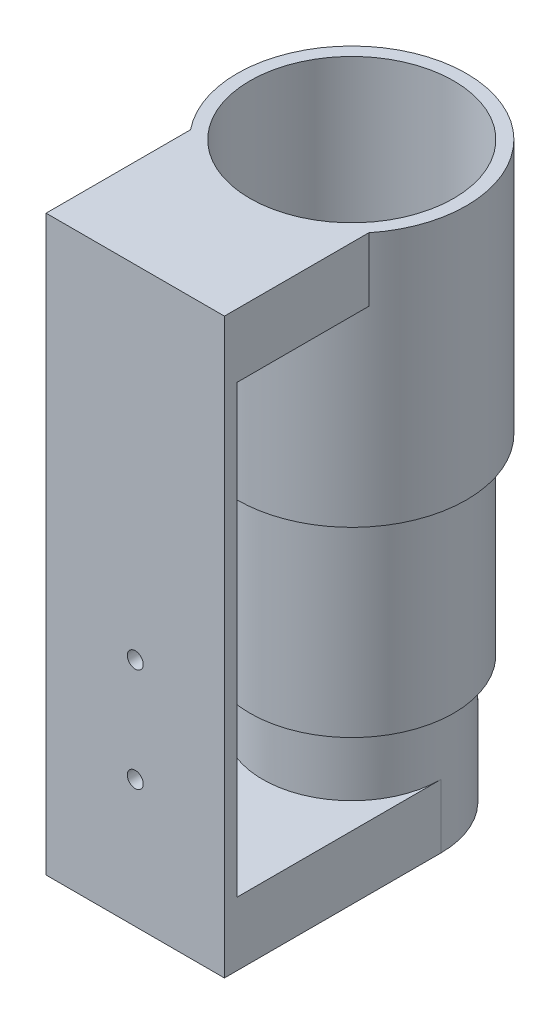
ISO-10303-21;
HEADER;
FILE_DESCRIPTION(('STEP AP214'),'2;1');
FILE_NAME('part.step','',(''),(''),'','','');
FILE_SCHEMA(('AUTOMOTIVE_DESIGN { 1 0 10303 214 1 1 1 1 }'));
ENDSEC;
DATA;
#1=APPLICATION_CONTEXT('core data for automotive mechanical design processes');
#2=APPLICATION_PROTOCOL_DEFINITION('international standard','automotive_design',2000,#1);
#3=PRODUCT_CONTEXT('',#1,'mechanical');
#4=PRODUCT('Part','Part','',(#3));
#5=PRODUCT_RELATED_PRODUCT_CATEGORY('part','',(#4));
#6=PRODUCT_DEFINITION_FORMATION('','',#4);
#7=PRODUCT_DEFINITION_CONTEXT('part definition',#1,'design');
#8=PRODUCT_DEFINITION('design','',#6,#7);
#9=PRODUCT_DEFINITION_SHAPE('','',#8);
#10=(LENGTH_UNIT() NAMED_UNIT(*) SI_UNIT(.MILLI.,.METRE.));
#11=(NAMED_UNIT(*) PLANE_ANGLE_UNIT() SI_UNIT($,.RADIAN.));
#12=(NAMED_UNIT(*) SI_UNIT($,.STERADIAN.) SOLID_ANGLE_UNIT());
#13=UNCERTAINTY_MEASURE_WITH_UNIT(LENGTH_MEASURE(1.E-05),#10,'distance_accuracy_value','');
#14=(GEOMETRIC_REPRESENTATION_CONTEXT(3) GLOBAL_UNCERTAINTY_ASSIGNED_CONTEXT((#13)) GLOBAL_UNIT_ASSIGNED_CONTEXT((#10,
#11,#12)) REPRESENTATION_CONTEXT('',''));
#15=CARTESIAN_POINT('',(0.,0.,0.));
#16=DIRECTION('',(0.,0.,1.));
#17=DIRECTION('',(1.,0.,0.));
#18=AXIS2_PLACEMENT_3D('',#15,#16,#17);
#19=CARTESIAN_POINT('',(0.,114.3,0.));
#20=DIRECTION('',(0.,1.,0.));
#21=DIRECTION('',(0.,0.,1.));
#22=AXIS2_PLACEMENT_3D('',#19,#20,#21);
#23=PLANE('',#22);
#24=CARTESIAN_POINT('',(0.,114.3,0.));
#25=DIRECTION('',(0.,1.,0.));
#26=DIRECTION('',(0.,0.,1.));
#27=AXIS2_PLACEMENT_3D('',#24,#25,#26);
#28=CIRCLE('',#27,22.86);
#29=CARTESIAN_POINT('',(17.78,114.3,14.3684097937106));
#30=VERTEX_POINT('',#29);
#31=CARTESIAN_POINT('',(-17.78,114.3,14.3684097937107));
#32=VERTEX_POINT('',#31);
#33=EDGE_CURVE('E12',#30,#32,#28,.T.);
#34=ORIENTED_EDGE('',*,*,#33,.T.);
#35=DIRECTION('',(0.,0.,1.));
#36=VECTOR('',#35,1.);
#37=CARTESIAN_POINT('',(-17.78,114.3,40.6405249409841));
#38=LINE('',#37,#36);
#39=CARTESIAN_POINT('',(-17.78,114.3,43.1805249409841));
#40=VERTEX_POINT('',#39);
#41=EDGE_CURVE('E78',#32,#40,#38,.T.);
#42=ORIENTED_EDGE('',*,*,#41,.T.);
#43=DIRECTION('',(-1.,0.,0.));
#44=VECTOR('',#43,1.);
#45=CARTESIAN_POINT('',(17.78,114.3,43.1805249409841));
#46=LINE('',#45,#44);
#47=CARTESIAN_POINT('',(17.78,114.3,43.1805249409841));
#48=VERTEX_POINT('',#47);
#49=EDGE_CURVE('E151',#48,#40,#46,.T.);
#50=ORIENTED_EDGE('',*,*,#49,.F.);
#51=DIRECTION('',(0.,0.,-1.));
#52=VECTOR('',#51,1.);
#53=CARTESIAN_POINT('',(17.78,114.3,40.6405249409841));
#54=LINE('',#53,#52);
#55=EDGE_CURVE('E57',#48,#30,#54,.T.);
#56=ORIENTED_EDGE('',*,*,#55,.T.);
#57=EDGE_LOOP('',(#34,#42,#50,#56));
#58=FACE_BOUND('',#57,.T.);
#59=CARTESIAN_POINT('',(0.,114.3,0.));
#60=DIRECTION('',(0.,1.,0.));
#61=DIRECTION('',(0.,0.,1.));
#62=AXIS2_PLACEMENT_3D('',#59,#60,#61);
#63=CIRCLE('',#62,20.32);
#64=CARTESIAN_POINT('',(0.,114.3,20.32));
#65=VERTEX_POINT('',#64);
#66=EDGE_CURVE('E241',#65,#65,#63,.T.);
#67=ORIENTED_EDGE('',*,*,#66,.F.);
#68=EDGE_LOOP('',(#67));
#69=FACE_BOUND('',#68,.T.);
#70=ADVANCED_FACE('F41',(#58,#69),#23,.T.);
#71=CARTESIAN_POINT('',(0.,63.5,0.));
#72=DIRECTION('',(0.,1.,0.));
#73=DIRECTION('',(0.,0.,1.));
#74=AXIS2_PLACEMENT_3D('',#71,#72,#73);
#75=PLANE('',#74);
#76=CARTESIAN_POINT('',(0.,63.5,0.));
#77=DIRECTION('',(0.,1.,0.));
#78=DIRECTION('',(0.,0.,1.));
#79=AXIS2_PLACEMENT_3D('',#76,#77,#78);
#80=CIRCLE('',#79,22.86);
#81=CARTESIAN_POINT('',(0.,63.5,22.86));
#82=VERTEX_POINT('',#81);
#83=EDGE_CURVE('E50',#82,#82,#80,.T.);
#84=ORIENTED_EDGE('',*,*,#83,.F.);
#85=EDGE_LOOP('',(#84));
#86=FACE_BOUND('',#85,.T.);
#87=CARTESIAN_POINT('',(0.,63.5,0.));
#88=DIRECTION('',(0.,1.,0.));
#89=DIRECTION('',(0.,0.,1.));
#90=AXIS2_PLACEMENT_3D('',#87,#88,#89);
#91=CIRCLE('',#90,20.32);
#92=CARTESIAN_POINT('',(0.,63.5,20.32));
#93=VERTEX_POINT('',#92);
#94=EDGE_CURVE('E239',#93,#93,#91,.T.);
#95=ORIENTED_EDGE('',*,*,#94,.T.);
#96=EDGE_LOOP('',(#95));
#97=FACE_BOUND('',#96,.T.);
#98=ADVANCED_FACE('F279',(#86,#97),#75,.F.);
#99=CARTESIAN_POINT('',(0.,114.3,0.));
#100=DIRECTION('',(0.,-1.,0.));
#101=DIRECTION('',(0.,0.,-1.));
#102=AXIS2_PLACEMENT_3D('',#99,#100,#101);
#103=CYLINDRICAL_SURFACE('',#102,22.86);
#104=CARTESIAN_POINT('',(0.,101.6,0.));
#105=DIRECTION('',(0.,-1.,0.));
#106=DIRECTION('',(0.,0.,-1.));
#107=AXIS2_PLACEMENT_3D('',#104,#105,#106);
#108=CIRCLE('',#107,22.86);
#109=CARTESIAN_POINT('',(17.78,101.6,14.3684097937106));
#110=VERTEX_POINT('',#109);
#111=CARTESIAN_POINT('',(-17.78,101.6,14.3684097937107));
#112=VERTEX_POINT('',#111);
#113=EDGE_CURVE('E231',#110,#112,#108,.T.);
#114=ORIENTED_EDGE('',*,*,#113,.T.);
#115=DIRECTION('',(0.,1.,0.));
#116=VECTOR('',#115,1.);
#117=CARTESIAN_POINT('',(-17.78,101.6,14.3684097937107));
#118=LINE('',#117,#116);
#119=EDGE_CURVE('E237',#112,#32,#118,.T.);
#120=ORIENTED_EDGE('',*,*,#119,.T.);
#121=ORIENTED_EDGE('',*,*,#33,.F.);
#122=DIRECTION('',(0.,1.,0.));
#123=VECTOR('',#122,1.);
#124=CARTESIAN_POINT('',(17.78,101.6,14.3684097937106));
#125=LINE('',#124,#123);
#126=EDGE_CURVE('E143',#110,#30,#125,.T.);
#127=ORIENTED_EDGE('',*,*,#126,.F.);
#128=EDGE_LOOP('',(#114,#120,#121,#127));
#129=FACE_BOUND('',#128,.T.);
#130=ORIENTED_EDGE('',*,*,#83,.T.);
#131=EDGE_LOOP('',(#130));
#132=FACE_BOUND('',#131,.T.);
#133=ADVANCED_FACE('F43',(#129,#132),#103,.T.);
#134=CARTESIAN_POINT('',(0.,114.3,0.));
#135=DIRECTION('',(0.,-1.,0.));
#136=DIRECTION('',(0.,0.,-1.));
#137=AXIS2_PLACEMENT_3D('',#134,#135,#136);
#138=CYLINDRICAL_SURFACE('',#137,20.32);
#139=ORIENTED_EDGE('',*,*,#66,.T.);
#140=EDGE_LOOP('',(#139));
#141=FACE_BOUND('',#140,.T.);
#142=ORIENTED_EDGE('',*,*,#94,.F.);
#143=EDGE_LOOP('',(#142));
#144=FACE_BOUND('',#143,.T.);
#145=ADVANCED_FACE('F286',(#141,#144),#138,.F.);
#146=CARTESIAN_POINT('',(-17.78,101.6,40.6405249409841));
#147=DIRECTION('',(-1.,0.,0.));
#148=DIRECTION('',(0.,0.,1.));
#149=AXIS2_PLACEMENT_3D('',#146,#147,#148);
#150=PLANE('',#149);
#151=ORIENTED_EDGE('',*,*,#41,.F.);
#152=ORIENTED_EDGE('',*,*,#119,.F.);
#153=DIRECTION('',(0.,0.,1.));
#154=VECTOR('',#153,1.);
#155=CARTESIAN_POINT('',(-17.78,101.6,40.6405249409841));
#156=LINE('',#155,#154);
#157=CARTESIAN_POINT('',(-17.78,101.6,40.6405249409841));
#158=VERTEX_POINT('',#157);
#159=EDGE_CURVE('E234',#112,#158,#156,.T.);
#160=ORIENTED_EDGE('',*,*,#159,.T.);
#161=DIRECTION('',(0.,1.,0.));
#162=VECTOR('',#161,1.);
#163=CARTESIAN_POINT('',(-17.78,12.7,40.6405249409841));
#164=LINE('',#163,#162);
#165=CARTESIAN_POINT('',(-17.78,12.7,40.6405249409841));
#166=VERTEX_POINT('',#165);
#167=EDGE_CURVE('E161',#166,#158,#164,.T.);
#168=ORIENTED_EDGE('',*,*,#167,.F.);
#169=DIRECTION('',(0.,0.,1.));
#170=VECTOR('',#169,1.);
#171=CARTESIAN_POINT('',(-17.78,12.7,0.));
#172=LINE('',#171,#170);
#173=CARTESIAN_POINT('',(-17.78,12.7,0.));
#174=VERTEX_POINT('',#173);
#175=EDGE_CURVE('E170',#174,#166,#172,.T.);
#176=ORIENTED_EDGE('',*,*,#175,.F.);
#177=DIRECTION('',(0.,-1.,0.));
#178=VECTOR('',#177,1.);
#179=CARTESIAN_POINT('',(-17.78,12.7,0.));
#180=LINE('',#179,#178);
#181=CARTESIAN_POINT('',(-17.78,0.,0.));
#182=VERTEX_POINT('',#181);
#183=EDGE_CURVE('E182',#174,#182,#180,.T.);
#184=ORIENTED_EDGE('',*,*,#183,.T.);
#185=DIRECTION('',(0.,0.,1.));
#186=VECTOR('',#185,1.);
#187=CARTESIAN_POINT('',(-17.78,0.,0.));
#188=LINE('',#187,#186);
#189=CARTESIAN_POINT('',(-17.78,0.,43.1805249409841));
#190=VERTEX_POINT('',#189);
#191=EDGE_CURVE('E175',#182,#190,#188,.T.);
#192=ORIENTED_EDGE('',*,*,#191,.T.);
#193=DIRECTION('',(0.,-1.,0.));
#194=VECTOR('',#193,1.);
#195=CARTESIAN_POINT('',(-17.78,12.7,43.1805249409841));
#196=LINE('',#195,#194);
#197=EDGE_CURVE('E154',#40,#190,#196,.T.);
#198=ORIENTED_EDGE('',*,*,#197,.F.);
#199=EDGE_LOOP('',(#151,#152,#160,#168,#176,#184,#192,#198));
#200=FACE_BOUND('',#199,.T.);
#201=ADVANCED_FACE('F289',(#200),#150,.T.);
#202=CARTESIAN_POINT('',(17.78,101.6,40.6405249409841));
#203=DIRECTION('',(1.,0.,0.));
#204=DIRECTION('',(0.,0.,-1.));
#205=AXIS2_PLACEMENT_3D('',#202,#203,#204);
#206=PLANE('',#205);
#207=ORIENTED_EDGE('',*,*,#55,.F.);
#208=DIRECTION('',(0.,-1.,0.));
#209=VECTOR('',#208,1.);
#210=CARTESIAN_POINT('',(17.78,12.7,43.1805249409841));
#211=LINE('',#210,#209);
#212=CARTESIAN_POINT('',(17.78,0.,43.1805249409841));
#213=VERTEX_POINT('',#212);
#214=EDGE_CURVE('E140',#48,#213,#211,.T.);
#215=ORIENTED_EDGE('',*,*,#214,.T.);
#216=DIRECTION('',(0.,0.,-1.));
#217=VECTOR('',#216,1.);
#218=CARTESIAN_POINT('',(17.78,0.,0.));
#219=LINE('',#218,#217);
#220=CARTESIAN_POINT('',(17.78,0.,0.));
#221=VERTEX_POINT('',#220);
#222=EDGE_CURVE('E171',#213,#221,#219,.T.);
#223=ORIENTED_EDGE('',*,*,#222,.T.);
#224=DIRECTION('',(0.,-1.,0.));
#225=VECTOR('',#224,1.);
#226=CARTESIAN_POINT('',(17.78,12.7,0.));
#227=LINE('',#226,#225);
#228=CARTESIAN_POINT('',(17.78,12.7,0.));
#229=VERTEX_POINT('',#228);
#230=EDGE_CURVE('E155',#229,#221,#227,.T.);
#231=ORIENTED_EDGE('',*,*,#230,.F.);
#232=DIRECTION('',(0.,0.,-1.));
#233=VECTOR('',#232,1.);
#234=CARTESIAN_POINT('',(17.78,12.7,0.));
#235=LINE('',#234,#233);
#236=CARTESIAN_POINT('',(17.78,12.7,40.6405249409841));
#237=VERTEX_POINT('',#236);
#238=EDGE_CURVE('E173',#237,#229,#235,.T.);
#239=ORIENTED_EDGE('',*,*,#238,.F.);
#240=DIRECTION('',(0.,1.,0.));
#241=VECTOR('',#240,1.);
#242=CARTESIAN_POINT('',(17.78,12.7,40.6405249409841));
#243=LINE('',#242,#241);
#244=CARTESIAN_POINT('',(17.78,101.6,40.6405249409841));
#245=VERTEX_POINT('',#244);
#246=EDGE_CURVE('E158',#237,#245,#243,.T.);
#247=ORIENTED_EDGE('',*,*,#246,.T.);
#248=DIRECTION('',(0.,0.,-1.));
#249=VECTOR('',#248,1.);
#250=CARTESIAN_POINT('',(17.78,101.6,40.6405249409841));
#251=LINE('',#250,#249);
#252=EDGE_CURVE('E84',#245,#110,#251,.T.);
#253=ORIENTED_EDGE('',*,*,#252,.T.);
#254=ORIENTED_EDGE('',*,*,#126,.T.);
#255=EDGE_LOOP('',(#207,#215,#223,#231,#239,#247,#253,#254));
#256=FACE_BOUND('',#255,.T.);
#257=ADVANCED_FACE('F139',(#256),#206,.T.);
#258=CARTESIAN_POINT('',(0.,101.6,0.));
#259=DIRECTION('',(0.,-1.,0.));
#260=DIRECTION('',(0.,0.,-1.));
#261=AXIS2_PLACEMENT_3D('',#258,#259,#260);
#262=PLANE('',#261);
#263=DIRECTION('',(1.,0.,0.));
#264=VECTOR('',#263,1.);
#265=CARTESIAN_POINT('',(17.78,101.6,40.6405249409841));
#266=LINE('',#265,#264);
#267=EDGE_CURVE('E66',#158,#245,#266,.T.);
#268=ORIENTED_EDGE('',*,*,#267,.F.);
#269=ORIENTED_EDGE('',*,*,#159,.F.);
#270=ORIENTED_EDGE('',*,*,#113,.F.);
#271=ORIENTED_EDGE('',*,*,#252,.F.);
#272=EDGE_LOOP('',(#268,#269,#270,#271));
#273=FACE_BOUND('',#272,.T.);
#274=ADVANCED_FACE('F293',(#273),#262,.T.);
#275=CARTESIAN_POINT('',(0.,12.7,0.));
#276=DIRECTION('',(0.,-1.,0.));
#277=DIRECTION('',(0.,0.,-1.));
#278=AXIS2_PLACEMENT_3D('',#275,#276,#277);
#279=PLANE('',#278);
#280=DIRECTION('',(-1.,0.,0.));
#281=VECTOR('',#280,1.);
#282=CARTESIAN_POINT('',(0.,12.7,40.6405249409841));
#283=LINE('',#282,#281);
#284=EDGE_CURVE('E145',#237,#166,#283,.T.);
#285=ORIENTED_EDGE('',*,*,#284,.F.);
#286=ORIENTED_EDGE('',*,*,#238,.T.);
#287=CARTESIAN_POINT('',(0.,12.7,0.));
#288=DIRECTION('',(0.,-1.,0.));
#289=DIRECTION('',(0.,0.,-1.));
#290=AXIS2_PLACEMENT_3D('',#287,#288,#289);
#291=CIRCLE('',#290,17.78);
#292=EDGE_CURVE('E167',#229,#174,#291,.T.);
#293=ORIENTED_EDGE('',*,*,#292,.T.);
#294=ORIENTED_EDGE('',*,*,#175,.T.);
#295=EDGE_LOOP('',(#285,#286,#293,#294));
#296=FACE_BOUND('',#295,.T.);
#297=ADVANCED_FACE('F298',(#296),#279,.F.);
#298=CARTESIAN_POINT('',(0.,25.4,0.));
#299=DIRECTION('',(0.,-1.,0.));
#300=DIRECTION('',(0.,0.,-1.));
#301=AXIS2_PLACEMENT_3D('',#298,#299,#300);
#302=CYLINDRICAL_SURFACE('',#301,17.78);
#303=CARTESIAN_POINT('',(0.,25.4,0.));
#304=DIRECTION('',(0.,1.,0.));
#305=DIRECTION('',(0.,0.,1.));
#306=AXIS2_PLACEMENT_3D('',#303,#304,#305);
#307=CIRCLE('',#306,17.78);
#308=CARTESIAN_POINT('',(0.,25.4,17.78));
#309=VERTEX_POINT('',#308);
#310=EDGE_CURVE('E189',#309,#309,#307,.T.);
#311=ORIENTED_EDGE('',*,*,#310,.F.);
#312=EDGE_LOOP('',(#311));
#313=FACE_BOUND('',#312,.T.);
#314=ORIENTED_EDGE('',*,*,#183,.F.);
#315=ORIENTED_EDGE('',*,*,#292,.F.);
#316=ORIENTED_EDGE('',*,*,#230,.T.);
#317=CARTESIAN_POINT('',(0.,0.,0.));
#318=DIRECTION('',(0.,1.,0.));
#319=DIRECTION('',(0.,0.,1.));
#320=AXIS2_PLACEMENT_3D('',#317,#318,#319);
#321=CIRCLE('',#320,17.78);
#322=EDGE_CURVE('E188',#221,#182,#321,.T.);
#323=ORIENTED_EDGE('',*,*,#322,.T.);
#324=EDGE_LOOP('',(#314,#315,#316,#323));
#325=FACE_BOUND('',#324,.T.);
#326=ADVANCED_FACE('F307',(#313,#325),#302,.T.);
#327=CARTESIAN_POINT('',(0.,6.35,0.));
#328=DIRECTION('',(0.,1.,0.));
#329=DIRECTION('',(0.,0.,1.));
#330=AXIS2_PLACEMENT_3D('',#327,#328,#329);
#331=PLANE('',#330);
#332=CARTESIAN_POINT('',(0.,6.35,0.));
#333=DIRECTION('',(0.,1.,0.));
#334=DIRECTION('',(0.,0.,1.));
#335=AXIS2_PLACEMENT_3D('',#332,#333,#334);
#336=CIRCLE('',#335,15.24);
#337=CARTESIAN_POINT('',(0.,6.35,15.24));
#338=VERTEX_POINT('',#337);
#339=EDGE_CURVE('E192',#338,#338,#336,.F.);
#340=ORIENTED_EDGE('',*,*,#339,.F.);
#341=EDGE_LOOP('',(#340));
#342=FACE_BOUND('',#341,.T.);
#343=DIRECTION('',(-1.,0.,0.));
#344=VECTOR('',#343,1.);
#345=CARTESIAN_POINT('',(-3.81,6.35,-3.81));
#346=LINE('',#345,#344);
#347=CARTESIAN_POINT('',(3.81,6.35,-3.81));
#348=VERTEX_POINT('',#347);
#349=CARTESIAN_POINT('',(-3.81,6.35,-3.81));
#350=VERTEX_POINT('',#349);
#351=EDGE_CURVE('E199',#348,#350,#346,.T.);
#352=ORIENTED_EDGE('',*,*,#351,.F.);
#353=DIRECTION('',(0.,0.,-1.));
#354=VECTOR('',#353,1.);
#355=CARTESIAN_POINT('',(3.81,6.35,3.81));
#356=LINE('',#355,#354);
#357=CARTESIAN_POINT('',(3.81,6.35,3.81));
#358=VERTEX_POINT('',#357);
#359=EDGE_CURVE('E197',#358,#348,#356,.T.);
#360=ORIENTED_EDGE('',*,*,#359,.F.);
#361=DIRECTION('',(1.,0.,0.));
#362=VECTOR('',#361,1.);
#363=CARTESIAN_POINT('',(-3.81,6.35,3.81));
#364=LINE('',#363,#362);
#365=CARTESIAN_POINT('',(-3.81,6.35,3.81));
#366=VERTEX_POINT('',#365);
#367=EDGE_CURVE('E205',#366,#358,#364,.T.);
#368=ORIENTED_EDGE('',*,*,#367,.F.);
#369=DIRECTION('',(0.,0.,1.));
#370=VECTOR('',#369,1.);
#371=CARTESIAN_POINT('',(-3.81,6.35,3.81));
#372=LINE('',#371,#370);
#373=EDGE_CURVE('E202',#350,#366,#372,.T.);
#374=ORIENTED_EDGE('',*,*,#373,.F.);
#375=EDGE_LOOP('',(#352,#360,#368,#374));
#376=FACE_BOUND('',#375,.T.);
#377=ADVANCED_FACE('F303',(#342,#376),#331,.T.);
#378=CARTESIAN_POINT('',(0.,0.,0.));
#379=DIRECTION('',(0.,1.,0.));
#380=DIRECTION('',(0.,0.,1.));
#381=AXIS2_PLACEMENT_3D('',#378,#379,#380);
#382=PLANE('',#381);
#383=DIRECTION('',(1.,0.,0.));
#384=VECTOR('',#383,1.);
#385=CARTESIAN_POINT('',(-17.78,0.,43.1805249409841));
#386=LINE('',#385,#384);
#387=EDGE_CURVE('E153',#190,#213,#386,.T.);
#388=ORIENTED_EDGE('',*,*,#387,.F.);
#389=ORIENTED_EDGE('',*,*,#191,.F.);
#390=ORIENTED_EDGE('',*,*,#322,.F.);
#391=ORIENTED_EDGE('',*,*,#222,.F.);
#392=EDGE_LOOP('',(#388,#389,#390,#391));
#393=FACE_BOUND('',#392,.T.);
#394=DIRECTION('',(0.,0.,-1.));
#395=VECTOR('',#394,1.);
#396=CARTESIAN_POINT('',(3.81,0.,3.81));
#397=LINE('',#396,#395);
#398=CARTESIAN_POINT('',(3.81,0.,3.81));
#399=VERTEX_POINT('',#398);
#400=CARTESIAN_POINT('',(3.81,0.,-3.81));
#401=VERTEX_POINT('',#400);
#402=EDGE_CURVE('E196',#399,#401,#397,.T.);
#403=ORIENTED_EDGE('',*,*,#402,.T.);
#404=DIRECTION('',(-1.,0.,0.));
#405=VECTOR('',#404,1.);
#406=CARTESIAN_POINT('',(-3.81,0.,-3.81));
#407=LINE('',#406,#405);
#408=CARTESIAN_POINT('',(-3.81,0.,-3.81));
#409=VERTEX_POINT('',#408);
#410=EDGE_CURVE('E210',#401,#409,#407,.T.);
#411=ORIENTED_EDGE('',*,*,#410,.T.);
#412=DIRECTION('',(0.,0.,1.));
#413=VECTOR('',#412,1.);
#414=CARTESIAN_POINT('',(-3.81,0.,3.81));
#415=LINE('',#414,#413);
#416=CARTESIAN_POINT('',(-3.81,0.,3.81));
#417=VERTEX_POINT('',#416);
#418=EDGE_CURVE('E213',#409,#417,#415,.T.);
#419=ORIENTED_EDGE('',*,*,#418,.T.);
#420=DIRECTION('',(1.,0.,0.));
#421=VECTOR('',#420,1.);
#422=CARTESIAN_POINT('',(-3.81,0.,3.81));
#423=LINE('',#422,#421);
#424=EDGE_CURVE('E200',#417,#399,#423,.T.);
#425=ORIENTED_EDGE('',*,*,#424,.T.);
#426=EDGE_LOOP('',(#403,#411,#419,#425));
#427=FACE_BOUND('',#426,.T.);
#428=ADVANCED_FACE('F299',(#393,#427),#382,.F.);
#429=CARTESIAN_POINT('',(3.81,6.35,3.81));
#430=DIRECTION('',(-1.,0.,0.));
#431=DIRECTION('',(0.,0.,1.));
#432=AXIS2_PLACEMENT_3D('',#429,#430,#431);
#433=PLANE('',#432);
#434=ORIENTED_EDGE('',*,*,#402,.F.);
#435=DIRECTION('',(0.,-1.,0.));
#436=VECTOR('',#435,1.);
#437=CARTESIAN_POINT('',(3.81,6.35,3.81));
#438=LINE('',#437,#436);
#439=EDGE_CURVE('E207',#358,#399,#438,.T.);
#440=ORIENTED_EDGE('',*,*,#439,.F.);
#441=ORIENTED_EDGE('',*,*,#359,.T.);
#442=DIRECTION('',(0.,-1.,0.));
#443=VECTOR('',#442,1.);
#444=CARTESIAN_POINT('',(3.81,6.35,-3.81));
#445=LINE('',#444,#443);
#446=EDGE_CURVE('E224',#348,#401,#445,.T.);
#447=ORIENTED_EDGE('',*,*,#446,.T.);
#448=EDGE_LOOP('',(#434,#440,#441,#447));
#449=FACE_BOUND('',#448,.T.);
#450=ADVANCED_FACE('F302',(#449),#433,.T.);
#451=CARTESIAN_POINT('',(-3.81,6.35,-3.81));
#452=DIRECTION('',(0.,0.,1.));
#453=DIRECTION('',(1.,0.,0.));
#454=AXIS2_PLACEMENT_3D('',#451,#452,#453);
#455=PLANE('',#454);
#456=ORIENTED_EDGE('',*,*,#410,.F.);
#457=ORIENTED_EDGE('',*,*,#446,.F.);
#458=ORIENTED_EDGE('',*,*,#351,.T.);
#459=DIRECTION('',(0.,-1.,0.));
#460=VECTOR('',#459,1.);
#461=CARTESIAN_POINT('',(-3.81,6.35,-3.81));
#462=LINE('',#461,#460);
#463=EDGE_CURVE('E222',#350,#409,#462,.T.);
#464=ORIENTED_EDGE('',*,*,#463,.T.);
#465=EDGE_LOOP('',(#456,#457,#458,#464));
#466=FACE_BOUND('',#465,.T.);
#467=ADVANCED_FACE('F311',(#466),#455,.T.);
#468=CARTESIAN_POINT('',(-3.81,6.35,3.81));
#469=DIRECTION('',(1.,0.,0.));
#470=DIRECTION('',(0.,0.,-1.));
#471=AXIS2_PLACEMENT_3D('',#468,#469,#470);
#472=PLANE('',#471);
#473=ORIENTED_EDGE('',*,*,#418,.F.);
#474=ORIENTED_EDGE('',*,*,#463,.F.);
#475=ORIENTED_EDGE('',*,*,#373,.T.);
#476=DIRECTION('',(0.,-1.,0.));
#477=VECTOR('',#476,1.);
#478=CARTESIAN_POINT('',(-3.81,6.35,3.81));
#479=LINE('',#478,#477);
#480=EDGE_CURVE('E220',#366,#417,#479,.T.);
#481=ORIENTED_EDGE('',*,*,#480,.T.);
#482=EDGE_LOOP('',(#473,#474,#475,#481));
#483=FACE_BOUND('',#482,.T.);
#484=ADVANCED_FACE('F315',(#483),#472,.T.);
#485=CARTESIAN_POINT('',(-3.81,6.35,3.81));
#486=DIRECTION('',(0.,0.,-1.));
#487=DIRECTION('',(-1.,0.,0.));
#488=AXIS2_PLACEMENT_3D('',#485,#486,#487);
#489=PLANE('',#488);
#490=ORIENTED_EDGE('',*,*,#424,.F.);
#491=ORIENTED_EDGE('',*,*,#480,.F.);
#492=ORIENTED_EDGE('',*,*,#367,.T.);
#493=ORIENTED_EDGE('',*,*,#439,.T.);
#494=EDGE_LOOP('',(#490,#491,#492,#493));
#495=FACE_BOUND('',#494,.T.);
#496=ADVANCED_FACE('F319',(#495),#489,.T.);
#497=CARTESIAN_POINT('',(0.,25.4,0.));
#498=DIRECTION('',(0.,1.,0.));
#499=DIRECTION('',(0.,0.,1.));
#500=AXIS2_PLACEMENT_3D('',#497,#498,#499);
#501=PLANE('',#500);
#502=ORIENTED_EDGE('',*,*,#310,.T.);
#503=EDGE_LOOP('',(#502));
#504=FACE_BOUND('',#503,.T.);
#505=CARTESIAN_POINT('',(0.,25.4,0.));
#506=DIRECTION('',(0.,1.,0.));
#507=DIRECTION('',(0.,0.,1.));
#508=AXIS2_PLACEMENT_3D('',#505,#506,#507);
#509=CIRCLE('',#508,15.24);
#510=CARTESIAN_POINT('',(0.,25.4,15.24));
#511=VERTEX_POINT('',#510);
#512=EDGE_CURVE('E185',#511,#511,#509,.T.);
#513=ORIENTED_EDGE('',*,*,#512,.F.);
#514=EDGE_LOOP('',(#513));
#515=FACE_BOUND('',#514,.T.);
#516=ADVANCED_FACE('F274',(#504,#515),#501,.T.);
#517=CARTESIAN_POINT('',(0.,25.4,0.));
#518=DIRECTION('',(0.,-1.,0.));
#519=DIRECTION('',(0.,0.,-1.));
#520=AXIS2_PLACEMENT_3D('',#517,#518,#519);
#521=CYLINDRICAL_SURFACE('',#520,15.24);
#522=ORIENTED_EDGE('',*,*,#339,.T.);
#523=EDGE_LOOP('',(#522));
#524=FACE_BOUND('',#523,.T.);
#525=ORIENTED_EDGE('',*,*,#512,.T.);
#526=EDGE_LOOP('',(#525));
#527=FACE_BOUND('',#526,.T.);
#528=ADVANCED_FACE('F265',(#524,#527),#521,.F.);
#529=CARTESIAN_POINT('',(-17.78,12.7,43.1805249409841));
#530=DIRECTION('',(0.,0.,-1.));
#531=DIRECTION('',(-1.,0.,0.));
#532=AXIS2_PLACEMENT_3D('',#529,#530,#531);
#533=PLANE('',#532);
#534=CARTESIAN_POINT('',(0.,46.0375,43.1805249409841));
#535=DIRECTION('',(0.,0.,1.));
#536=DIRECTION('',(1.,0.,0.));
#537=AXIS2_PLACEMENT_3D('',#534,#535,#536);
#538=CIRCLE('',#537,1.5875);
#539=CARTESIAN_POINT('',(1.58750000000001,46.0375,43.1805249409841));
#540=VERTEX_POINT('',#539);
#541=EDGE_CURVE('E248',#540,#540,#538,.T.);
#542=ORIENTED_EDGE('',*,*,#541,.F.);
#543=EDGE_LOOP('',(#542));
#544=FACE_BOUND('',#543,.T.);
#545=CARTESIAN_POINT('',(0.,25.4,43.1805249409841));
#546=DIRECTION('',(0.,0.,1.));
#547=DIRECTION('',(1.,0.,0.));
#548=AXIS2_PLACEMENT_3D('',#545,#546,#547);
#549=CIRCLE('',#548,1.5875);
#550=CARTESIAN_POINT('',(1.58750000000001,25.4,43.1805249409841));
#551=VERTEX_POINT('',#550);
#552=EDGE_CURVE('E252',#551,#551,#549,.T.);
#553=ORIENTED_EDGE('',*,*,#552,.F.);
#554=EDGE_LOOP('',(#553));
#555=FACE_BOUND('',#554,.T.);
#556=ORIENTED_EDGE('',*,*,#387,.T.);
#557=ORIENTED_EDGE('',*,*,#214,.F.);
#558=ORIENTED_EDGE('',*,*,#49,.T.);
#559=ORIENTED_EDGE('',*,*,#197,.T.);
#560=EDGE_LOOP('',(#556,#557,#558,#559));
#561=FACE_BOUND('',#560,.T.);
#562=ADVANCED_FACE('F149',(#544,#555,#561),#533,.F.);
#563=CARTESIAN_POINT('',(0.,0.,40.6405249409841));
#564=DIRECTION('',(0.,0.,1.));
#565=DIRECTION('',(1.,0.,0.));
#566=AXIS2_PLACEMENT_3D('',#563,#564,#565);
#567=PLANE('',#566);
#568=CARTESIAN_POINT('',(0.,46.0375,40.6405249409841));
#569=DIRECTION('',(0.,0.,1.));
#570=DIRECTION('',(1.,0.,0.));
#571=AXIS2_PLACEMENT_3D('',#568,#569,#570);
#572=CIRCLE('',#571,1.5875);
#573=CARTESIAN_POINT('',(1.58750000000001,46.0375,40.6405249409841));
#574=VERTEX_POINT('',#573);
#575=EDGE_CURVE('E45',#574,#574,#572,.T.);
#576=ORIENTED_EDGE('',*,*,#575,.T.);
#577=EDGE_LOOP('',(#576));
#578=FACE_BOUND('',#577,.T.);
#579=CARTESIAN_POINT('',(0.,25.4,40.6405249409841));
#580=DIRECTION('',(0.,0.,1.));
#581=DIRECTION('',(1.,0.,0.));
#582=AXIS2_PLACEMENT_3D('',#579,#580,#581);
#583=CIRCLE('',#582,1.5875);
#584=CARTESIAN_POINT('',(1.58750000000001,25.4,40.6405249409841));
#585=VERTEX_POINT('',#584);
#586=EDGE_CURVE('E164',#585,#585,#583,.T.);
#587=ORIENTED_EDGE('',*,*,#586,.T.);
#588=EDGE_LOOP('',(#587));
#589=FACE_BOUND('',#588,.T.);
#590=ORIENTED_EDGE('',*,*,#267,.T.);
#591=ORIENTED_EDGE('',*,*,#246,.F.);
#592=ORIENTED_EDGE('',*,*,#284,.T.);
#593=ORIENTED_EDGE('',*,*,#167,.T.);
#594=EDGE_LOOP('',(#590,#591,#592,#593));
#595=FACE_BOUND('',#594,.T.);
#596=ADVANCED_FACE('F264',(#578,#589,#595),#567,.F.);
#597=CARTESIAN_POINT('',(0.,25.4,33.0205249409841));
#598=DIRECTION('',(0.,0.,1.));
#599=DIRECTION('',(1.,0.,0.));
#600=AXIS2_PLACEMENT_3D('',#597,#598,#599);
#601=CYLINDRICAL_SURFACE('',#600,1.5875);
#602=ORIENTED_EDGE('',*,*,#552,.T.);
#603=EDGE_LOOP('',(#602));
#604=FACE_BOUND('',#603,.T.);
#605=ORIENTED_EDGE('',*,*,#586,.F.);
#606=EDGE_LOOP('',(#605));
#607=FACE_BOUND('',#606,.T.);
#608=ADVANCED_FACE('F260',(#604,#607),#601,.F.);
#609=CARTESIAN_POINT('',(0.,46.0375,33.0205249409841));
#610=DIRECTION('',(0.,0.,1.));
#611=DIRECTION('',(1.,0.,0.));
#612=AXIS2_PLACEMENT_3D('',#609,#610,#611);
#613=CYLINDRICAL_SURFACE('',#612,1.5875);
#614=ORIENTED_EDGE('',*,*,#541,.T.);
#615=EDGE_LOOP('',(#614));
#616=FACE_BOUND('',#615,.T.);
#617=ORIENTED_EDGE('',*,*,#575,.F.);
#618=EDGE_LOOP('',(#617));
#619=FACE_BOUND('',#618,.T.);
#620=ADVANCED_FACE('F449',(#616,#619),#613,.F.);
#621=CLOSED_SHELL('',(#70,#98,#133,#145,#201,#257,#274,#297,#326,#377,#428,#450,#467,#484,#496,
#516,#528,#562,#596,#608,#620));
#622=MANIFOLD_SOLID_BREP('B2',#621);
#623=CARTESIAN_POINT('',(0.,63.5,0.));
#624=DIRECTION('',(0.,1.,0.));
#625=DIRECTION('',(0.,0.,1.));
#626=AXIS2_PLACEMENT_3D('',#623,#624,#625);
#627=PLANE('',#626);
#628=CARTESIAN_POINT('',(0.,63.5,0.));
#629=DIRECTION('',(0.,1.,0.));
#630=DIRECTION('',(0.,0.,1.));
#631=AXIS2_PLACEMENT_3D('',#628,#629,#630);
#632=CIRCLE('',#631,20.32);
#633=CARTESIAN_POINT('',(0.,63.5,-20.32));
#634=VERTEX_POINT('',#633);
#635=EDGE_CURVE('E40',#634,#634,#632,.T.);
#636=ORIENTED_EDGE('',*,*,#635,.T.);
#637=EDGE_LOOP('',(#636));
#638=FACE_BOUND('',#637,.T.);
#639=CARTESIAN_POINT('',(0.,63.5,0.));
#640=DIRECTION('',(0.,1.,0.));
#641=DIRECTION('',(0.,0.,1.));
#642=AXIS2_PLACEMENT_3D('',#639,#640,#641);
#643=CIRCLE('',#642,17.78);
#644=CARTESIAN_POINT('',(0.,63.5,-17.78));
#645=VERTEX_POINT('',#644);
#646=EDGE_CURVE('E542',#645,#645,#643,.T.);
#647=ORIENTED_EDGE('',*,*,#646,.F.);
#648=EDGE_LOOP('',(#647));
#649=FACE_BOUND('',#648,.T.);
#650=ADVANCED_FACE('F531',(#638,#649),#627,.T.);
#651=CARTESIAN_POINT('',(0.,25.4,0.));
#652=DIRECTION('',(0.,1.,0.));
#653=DIRECTION('',(0.,0.,1.));
#654=AXIS2_PLACEMENT_3D('',#651,#652,#653);
#655=PLANE('',#654);
#656=CARTESIAN_POINT('',(0.,25.4,0.));
#657=DIRECTION('',(0.,1.,0.));
#658=DIRECTION('',(0.,0.,1.));
#659=AXIS2_PLACEMENT_3D('',#656,#657,#658);
#660=CIRCLE('',#659,20.32);
#661=CARTESIAN_POINT('',(0.,25.4,-20.32));
#662=VERTEX_POINT('',#661);
#663=EDGE_CURVE('E535',#662,#662,#660,.T.);
#664=ORIENTED_EDGE('',*,*,#663,.F.);
#665=EDGE_LOOP('',(#664));
#666=FACE_BOUND('',#665,.T.);
#667=CARTESIAN_POINT('',(0.,25.4,0.));
#668=DIRECTION('',(0.,1.,0.));
#669=DIRECTION('',(0.,0.,1.));
#670=AXIS2_PLACEMENT_3D('',#667,#668,#669);
#671=CIRCLE('',#670,17.78);
#672=CARTESIAN_POINT('',(0.,25.4,-17.78));
#673=VERTEX_POINT('',#672);
#674=EDGE_CURVE('E544',#673,#673,#671,.T.);
#675=ORIENTED_EDGE('',*,*,#674,.T.);
#676=EDGE_LOOP('',(#675));
#677=FACE_BOUND('',#676,.T.);
#678=ADVANCED_FACE('F554',(#666,#677),#655,.F.);
#679=CARTESIAN_POINT('',(0.,63.5,0.));
#680=DIRECTION('',(0.,-1.,0.));
#681=DIRECTION('',(0.,0.,-1.));
#682=AXIS2_PLACEMENT_3D('',#679,#680,#681);
#683=CYLINDRICAL_SURFACE('',#682,20.32);
#684=CARTESIAN_POINT('',(0.,63.5,-20.32));
#685=CARTESIAN_POINT('',(0.,63.103125,-20.32));
#686=CARTESIAN_POINT('',(0.,62.70625,-20.32));
#687=CARTESIAN_POINT('',(0.,61.9125,-20.32));
#688=CARTESIAN_POINT('',(0.,61.515625,-20.32));
#689=CARTESIAN_POINT('',(0.,60.721875,-20.32));
#690=CARTESIAN_POINT('',(0.,60.325,-20.32));
#691=CARTESIAN_POINT('',(0.,59.53125,-20.32));
#692=CARTESIAN_POINT('',(0.,59.134375,-20.32));
#693=CARTESIAN_POINT('',(0.,58.340625,-20.32));
#694=CARTESIAN_POINT('',(0.,57.94375,-20.32));
#695=CARTESIAN_POINT('',(0.,57.15,-20.32));
#696=CARTESIAN_POINT('',(0.,56.753125,-20.32));
#697=CARTESIAN_POINT('',(0.,55.959375,-20.32));
#698=CARTESIAN_POINT('',(0.,55.5625,-20.32));
#699=CARTESIAN_POINT('',(0.,54.76875,-20.32));
#700=CARTESIAN_POINT('',(0.,54.371875,-20.32));
#701=CARTESIAN_POINT('',(0.,53.578125,-20.32));
#702=CARTESIAN_POINT('',(0.,53.18125,-20.32));
#703=CARTESIAN_POINT('',(0.,52.3875,-20.32));
#704=CARTESIAN_POINT('',(0.,51.990625,-20.32));
#705=CARTESIAN_POINT('',(0.,51.196875,-20.32));
#706=CARTESIAN_POINT('',(0.,50.8,-20.32));
#707=CARTESIAN_POINT('',(0.,50.00625,-20.32));
#708=CARTESIAN_POINT('',(0.,49.609375,-20.32));
#709=CARTESIAN_POINT('',(0.,48.815625,-20.32));
#710=CARTESIAN_POINT('',(0.,48.41875,-20.32));
#711=CARTESIAN_POINT('',(0.,47.625,-20.32));
#712=CARTESIAN_POINT('',(0.,47.228125,-20.32));
#713=CARTESIAN_POINT('',(0.,46.434375,-20.32));
#714=CARTESIAN_POINT('',(0.,46.0375,-20.32));
#715=CARTESIAN_POINT('',(0.,45.24375,-20.32));
#716=CARTESIAN_POINT('',(0.,44.846875,-20.32));
#717=CARTESIAN_POINT('',(0.,44.053125,-20.32));
#718=CARTESIAN_POINT('',(0.,43.65625,-20.32));
#719=CARTESIAN_POINT('',(0.,42.8625,-20.32));
#720=CARTESIAN_POINT('',(0.,42.465625,-20.32));
#721=CARTESIAN_POINT('',(0.,41.671875,-20.32));
#722=CARTESIAN_POINT('',(0.,41.275,-20.32));
#723=CARTESIAN_POINT('',(0.,40.48125,-20.32));
#724=CARTESIAN_POINT('',(0.,40.084375,-20.32));
#725=CARTESIAN_POINT('',(0.,39.290625,-20.32));
#726=CARTESIAN_POINT('',(0.,38.89375,-20.32));
#727=CARTESIAN_POINT('',(0.,38.1,-20.32));
#728=CARTESIAN_POINT('',(0.,37.703125,-20.32));
#729=CARTESIAN_POINT('',(0.,36.909375,-20.32));
#730=CARTESIAN_POINT('',(0.,36.5125,-20.32));
#731=CARTESIAN_POINT('',(0.,35.71875,-20.32));
#732=CARTESIAN_POINT('',(0.,35.321875,-20.32));
#733=CARTESIAN_POINT('',(0.,34.528125,-20.32));
#734=CARTESIAN_POINT('',(0.,34.13125,-20.32));
#735=CARTESIAN_POINT('',(0.,33.3375,-20.32));
#736=CARTESIAN_POINT('',(0.,32.940625,-20.32));
#737=CARTESIAN_POINT('',(0.,32.146875,-20.32));
#738=CARTESIAN_POINT('',(0.,31.75,-20.32));
#739=CARTESIAN_POINT('',(0.,30.95625,-20.32));
#740=CARTESIAN_POINT('',(0.,30.559375,-20.32));
#741=CARTESIAN_POINT('',(0.,29.765625,-20.32));
#742=CARTESIAN_POINT('',(0.,29.36875,-20.32));
#743=CARTESIAN_POINT('',(0.,28.575,-20.32));
#744=CARTESIAN_POINT('',(0.,28.178125,-20.32));
#745=CARTESIAN_POINT('',(0.,27.384375,-20.32));
#746=CARTESIAN_POINT('',(0.,26.9875,-20.32));
#747=CARTESIAN_POINT('',(0.,26.19375,-20.32));
#748=CARTESIAN_POINT('',(0.,25.796875,-20.32));
#749=CARTESIAN_POINT('',(0.,25.4,-20.32));
#750=B_SPLINE_CURVE_WITH_KNOTS('',3,(#684,#685,#686,#687,#688,#689,#690,#691,#692,#693,#694,
#695,#696,#697,#698,#699,#700,#701,#702,#703,#704,#705,#706,#707,#708,#709,#710,#711,#712,#713,
#714,#715,#716,#717,#718,#719,#720,#721,#722,#723,#724,#725,#726,#727,#728,#729,#730,#731,#732,
#733,#734,#735,#736,#737,#738,#739,#740,#741,#742,#743,#744,#745,#746,#747,#748,#749),
.UNSPECIFIED.,.F.,.F.,(4,2,2,2,2,2,2,2,2,2,2,2,2,2,2,2,2,2,2,2,2,2,2,2,2,2,2,2,2,2,2,2,4),(0.,
1.19062499999999,2.38124999999999,3.571875,4.76249999999999,5.95312499999999,7.14374999999999,
8.33437499999999,9.52499999999999,10.715625,11.90625,13.096875,14.2875,15.478125,16.66875,
17.859375,19.05,20.240625,21.43125,22.621875,23.8125,25.003125,26.19375,27.384375,28.575,
29.765625,30.95625,32.146875,33.3375,34.528125,35.71875,36.909375,38.1),.UNSPECIFIED.);
#751=EDGE_CURVE('BSEAM533',#634,#662,#750,.T.);
#752=ORIENTED_EDGE('',*,*,#635,.F.);
#753=ORIENTED_EDGE('',*,*,#663,.T.);
#754=ORIENTED_EDGE('',*,*,#751,.T.);
#755=ORIENTED_EDGE('',*,*,#751,.F.);
#756=EDGE_LOOP('',(#752,#754,#753,#755));
#757=FACE_BOUND('',#756,.T.);
#758=ADVANCED_FACE('F533',(#757),#683,.T.);
#759=CARTESIAN_POINT('',(0.,63.5,0.));
#760=DIRECTION('',(0.,-1.,0.));
#761=DIRECTION('',(0.,0.,-1.));
#762=AXIS2_PLACEMENT_3D('',#759,#760,#761);
#763=CYLINDRICAL_SURFACE('',#762,17.78);
#764=CARTESIAN_POINT('',(0.,63.5,-17.78));
#765=CARTESIAN_POINT('',(0.,63.103125,-17.78));
#766=CARTESIAN_POINT('',(0.,62.70625,-17.78));
#767=CARTESIAN_POINT('',(0.,61.9125,-17.78));
#768=CARTESIAN_POINT('',(0.,61.515625,-17.78));
#769=CARTESIAN_POINT('',(0.,60.721875,-17.78));
#770=CARTESIAN_POINT('',(0.,60.325,-17.78));
#771=CARTESIAN_POINT('',(0.,59.53125,-17.78));
#772=CARTESIAN_POINT('',(0.,59.134375,-17.78));
#773=CARTESIAN_POINT('',(0.,58.340625,-17.78));
#774=CARTESIAN_POINT('',(0.,57.94375,-17.78));
#775=CARTESIAN_POINT('',(0.,57.15,-17.78));
#776=CARTESIAN_POINT('',(0.,56.753125,-17.78));
#777=CARTESIAN_POINT('',(0.,55.959375,-17.78));
#778=CARTESIAN_POINT('',(0.,55.5625,-17.78));
#779=CARTESIAN_POINT('',(0.,54.76875,-17.78));
#780=CARTESIAN_POINT('',(0.,54.371875,-17.78));
#781=CARTESIAN_POINT('',(0.,53.578125,-17.78));
#782=CARTESIAN_POINT('',(0.,53.18125,-17.78));
#783=CARTESIAN_POINT('',(0.,52.3875,-17.78));
#784=CARTESIAN_POINT('',(0.,51.990625,-17.78));
#785=CARTESIAN_POINT('',(0.,51.196875,-17.78));
#786=CARTESIAN_POINT('',(0.,50.8,-17.78));
#787=CARTESIAN_POINT('',(0.,50.00625,-17.78));
#788=CARTESIAN_POINT('',(0.,49.609375,-17.78));
#789=CARTESIAN_POINT('',(0.,48.815625,-17.78));
#790=CARTESIAN_POINT('',(0.,48.41875,-17.78));
#791=CARTESIAN_POINT('',(0.,47.625,-17.78));
#792=CARTESIAN_POINT('',(0.,47.228125,-17.78));
#793=CARTESIAN_POINT('',(0.,46.434375,-17.78));
#794=CARTESIAN_POINT('',(0.,46.0375,-17.78));
#795=CARTESIAN_POINT('',(0.,45.24375,-17.78));
#796=CARTESIAN_POINT('',(0.,44.846875,-17.78));
#797=CARTESIAN_POINT('',(0.,44.053125,-17.78));
#798=CARTESIAN_POINT('',(0.,43.65625,-17.78));
#799=CARTESIAN_POINT('',(0.,42.8625,-17.78));
#800=CARTESIAN_POINT('',(0.,42.465625,-17.78));
#801=CARTESIAN_POINT('',(0.,41.671875,-17.78));
#802=CARTESIAN_POINT('',(0.,41.275,-17.78));
#803=CARTESIAN_POINT('',(0.,40.48125,-17.78));
#804=CARTESIAN_POINT('',(0.,40.084375,-17.78));
#805=CARTESIAN_POINT('',(0.,39.290625,-17.78));
#806=CARTESIAN_POINT('',(0.,38.89375,-17.78));
#807=CARTESIAN_POINT('',(0.,38.1,-17.78));
#808=CARTESIAN_POINT('',(0.,37.703125,-17.78));
#809=CARTESIAN_POINT('',(0.,36.909375,-17.78));
#810=CARTESIAN_POINT('',(0.,36.5125,-17.78));
#811=CARTESIAN_POINT('',(0.,35.71875,-17.78));
#812=CARTESIAN_POINT('',(0.,35.321875,-17.78));
#813=CARTESIAN_POINT('',(0.,34.528125,-17.78));
#814=CARTESIAN_POINT('',(0.,34.13125,-17.78));
#815=CARTESIAN_POINT('',(0.,33.3375,-17.78));
#816=CARTESIAN_POINT('',(0.,32.940625,-17.78));
#817=CARTESIAN_POINT('',(0.,32.146875,-17.78));
#818=CARTESIAN_POINT('',(0.,31.75,-17.78));
#819=CARTESIAN_POINT('',(0.,30.95625,-17.78));
#820=CARTESIAN_POINT('',(0.,30.559375,-17.78));
#821=CARTESIAN_POINT('',(0.,29.765625,-17.78));
#822=CARTESIAN_POINT('',(0.,29.36875,-17.78));
#823=CARTESIAN_POINT('',(0.,28.575,-17.78));
#824=CARTESIAN_POINT('',(0.,28.178125,-17.78));
#825=CARTESIAN_POINT('',(0.,27.384375,-17.78));
#826=CARTESIAN_POINT('',(0.,26.9875,-17.78));
#827=CARTESIAN_POINT('',(0.,26.19375,-17.78));
#828=CARTESIAN_POINT('',(0.,25.796875,-17.78));
#829=CARTESIAN_POINT('',(0.,25.4,-17.78));
#830=B_SPLINE_CURVE_WITH_KNOTS('',3,(#764,#765,#766,#767,#768,#769,#770,#771,#772,#773,#774,
#775,#776,#777,#778,#779,#780,#781,#782,#783,#784,#785,#786,#787,#788,#789,#790,#791,#792,#793,
#794,#795,#796,#797,#798,#799,#800,#801,#802,#803,#804,#805,#806,#807,#808,#809,#810,#811,#812,
#813,#814,#815,#816,#817,#818,#819,#820,#821,#822,#823,#824,#825,#826,#827,#828,#829),
.UNSPECIFIED.,.F.,.F.,(4,2,2,2,2,2,2,2,2,2,2,2,2,2,2,2,2,2,2,2,2,2,2,2,2,2,2,2,2,2,2,2,4),(0.,
1.19062499999999,2.38124999999999,3.571875,4.76249999999999,5.95312499999999,7.14374999999999,
8.33437499999999,9.52499999999999,10.715625,11.90625,13.096875,14.2875,15.478125,16.66875,
17.859375,19.05,20.240625,21.43125,22.621875,23.8125,25.003125,26.19375,27.384375,28.575,
29.765625,30.95625,32.146875,33.3375,34.528125,35.71875,36.909375,38.1),.UNSPECIFIED.);
#831=EDGE_CURVE('BSEAM550',#645,#673,#830,.T.);
#832=ORIENTED_EDGE('',*,*,#646,.T.);
#833=ORIENTED_EDGE('',*,*,#674,.F.);
#834=ORIENTED_EDGE('',*,*,#831,.T.);
#835=ORIENTED_EDGE('',*,*,#831,.F.);
#836=EDGE_LOOP('',(#832,#834,#833,#835));
#837=FACE_BOUND('',#836,.T.);
#838=ADVANCED_FACE('F550',(#837),#763,.F.);
#839=CLOSED_SHELL('',(#650,#678,#758,#838));
#840=MANIFOLD_SOLID_BREP('B6',#839);
#841=ADVANCED_BREP_SHAPE_REPRESENTATION('',(#18,#622,#840),#14);
#842=SHAPE_DEFINITION_REPRESENTATION(#9,#841);
ENDSEC;
END-ISO-10303-21;
